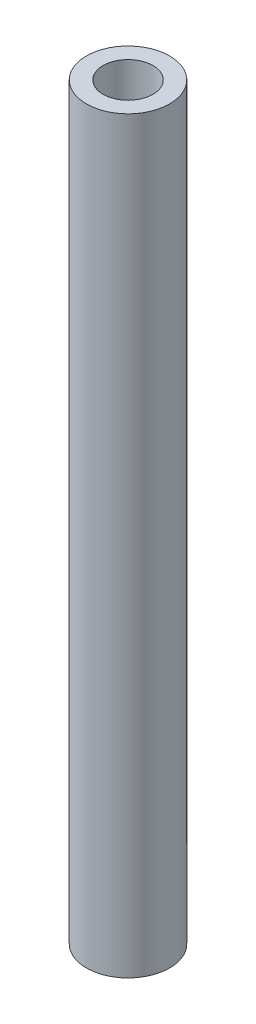
ISO-10303-21;
HEADER;
FILE_DESCRIPTION(('STEP AP214'),'2;1');
FILE_NAME('part.step','',(''),(''),'','','');
FILE_SCHEMA(('AUTOMOTIVE_DESIGN { 1 0 10303 214 1 1 1 1 }'));
ENDSEC;
DATA;
#1=APPLICATION_CONTEXT('core data for automotive mechanical design processes');
#2=APPLICATION_PROTOCOL_DEFINITION('international standard','automotive_design',2000,#1);
#3=PRODUCT_CONTEXT('',#1,'mechanical');
#4=PRODUCT('Part','Part','',(#3));
#5=PRODUCT_RELATED_PRODUCT_CATEGORY('part','',(#4));
#6=PRODUCT_DEFINITION_FORMATION('','',#4);
#7=PRODUCT_DEFINITION_CONTEXT('part definition',#1,'design');
#8=PRODUCT_DEFINITION('design','',#6,#7);
#9=PRODUCT_DEFINITION_SHAPE('','',#8);
#10=(LENGTH_UNIT() NAMED_UNIT(*) SI_UNIT(.MILLI.,.METRE.));
#11=(NAMED_UNIT(*) PLANE_ANGLE_UNIT() SI_UNIT($,.RADIAN.));
#12=(NAMED_UNIT(*) SI_UNIT($,.STERADIAN.) SOLID_ANGLE_UNIT());
#13=UNCERTAINTY_MEASURE_WITH_UNIT(LENGTH_MEASURE(1.E-05),#10,'distance_accuracy_value','');
#14=(GEOMETRIC_REPRESENTATION_CONTEXT(3) GLOBAL_UNCERTAINTY_ASSIGNED_CONTEXT((#13)) GLOBAL_UNIT_ASSIGNED_CONTEXT((#10,
#11,#12)) REPRESENTATION_CONTEXT('',''));
#15=CARTESIAN_POINT('',(0.,0.,0.));
#16=DIRECTION('',(0.,0.,1.));
#17=DIRECTION('',(1.,0.,0.));
#18=AXIS2_PLACEMENT_3D('',#15,#16,#17);
#19=CARTESIAN_POINT('',(0.,45.,0.));
#20=DIRECTION('',(0.,1.,0.));
#21=DIRECTION('',(0.,0.,1.));
#22=AXIS2_PLACEMENT_3D('',#19,#20,#21);
#23=PLANE('',#22);
#24=CARTESIAN_POINT('',(0.,45.,0.));
#25=DIRECTION('',(0.,1.,0.));
#26=DIRECTION('',(0.,0.,1.));
#27=AXIS2_PLACEMENT_3D('',#24,#25,#26);
#28=CIRCLE('',#27,2.5);
#29=CARTESIAN_POINT('',(0.,45.,-2.5));
#30=VERTEX_POINT('',#29);
#31=EDGE_CURVE('E10',#30,#30,#28,.T.);
#32=ORIENTED_EDGE('',*,*,#31,.T.);
#33=EDGE_LOOP('',(#32));
#34=FACE_BOUND('',#33,.T.);
#35=CARTESIAN_POINT('',(0.,45.,0.));
#36=DIRECTION('',(0.,1.,0.));
#37=DIRECTION('',(0.,0.,1.));
#38=AXIS2_PLACEMENT_3D('',#35,#36,#37);
#39=CIRCLE('',#38,1.5);
#40=CARTESIAN_POINT('',(0.,45.,-1.5));
#41=VERTEX_POINT('',#40);
#42=EDGE_CURVE('E45',#41,#41,#39,.T.);
#43=ORIENTED_EDGE('',*,*,#42,.F.);
#44=EDGE_LOOP('',(#43));
#45=FACE_BOUND('',#44,.T.);
#46=ADVANCED_FACE('F34',(#34,#45),#23,.T.);
#47=CARTESIAN_POINT('',(0.,0.,0.));
#48=DIRECTION('',(0.,1.,0.));
#49=DIRECTION('',(0.,0.,1.));
#50=AXIS2_PLACEMENT_3D('',#47,#48,#49);
#51=PLANE('',#50);
#52=CARTESIAN_POINT('',(0.,0.,0.));
#53=DIRECTION('',(0.,1.,0.));
#54=DIRECTION('',(0.,0.,1.));
#55=AXIS2_PLACEMENT_3D('',#52,#53,#54);
#56=CIRCLE('',#55,2.5);
#57=CARTESIAN_POINT('',(0.,0.,-2.5));
#58=VERTEX_POINT('',#57);
#59=EDGE_CURVE('E38',#58,#58,#56,.T.);
#60=ORIENTED_EDGE('',*,*,#59,.F.);
#61=EDGE_LOOP('',(#60));
#62=FACE_BOUND('',#61,.T.);
#63=CARTESIAN_POINT('',(0.,0.,0.));
#64=DIRECTION('',(0.,1.,0.));
#65=DIRECTION('',(0.,0.,1.));
#66=AXIS2_PLACEMENT_3D('',#63,#64,#65);
#67=CIRCLE('',#66,1.5);
#68=CARTESIAN_POINT('',(0.,0.,-1.5));
#69=VERTEX_POINT('',#68);
#70=EDGE_CURVE('E47',#69,#69,#67,.T.);
#71=ORIENTED_EDGE('',*,*,#70,.T.);
#72=EDGE_LOOP('',(#71));
#73=FACE_BOUND('',#72,.T.);
#74=ADVANCED_FACE('F57',(#62,#73),#51,.F.);
#75=CARTESIAN_POINT('',(0.,45.,0.));
#76=DIRECTION('',(0.,-1.,0.));
#77=DIRECTION('',(0.,0.,-1.));
#78=AXIS2_PLACEMENT_3D('',#75,#76,#77);
#79=CYLINDRICAL_SURFACE('',#78,2.5);
#80=CARTESIAN_POINT('',(0.,45.,-2.5));
#81=CARTESIAN_POINT('',(0.,44.53125,-2.5));
#82=CARTESIAN_POINT('',(0.,44.0625,-2.5));
#83=CARTESIAN_POINT('',(0.,43.125,-2.5));
#84=CARTESIAN_POINT('',(0.,42.65625,-2.5));
#85=CARTESIAN_POINT('',(0.,41.71875,-2.5));
#86=CARTESIAN_POINT('',(0.,41.25,-2.5));
#87=CARTESIAN_POINT('',(0.,40.3125,-2.5));
#88=CARTESIAN_POINT('',(0.,39.84375,-2.5));
#89=CARTESIAN_POINT('',(0.,38.90625,-2.5));
#90=CARTESIAN_POINT('',(0.,38.4375,-2.5));
#91=CARTESIAN_POINT('',(0.,37.5,-2.5));
#92=CARTESIAN_POINT('',(0.,37.03125,-2.5));
#93=CARTESIAN_POINT('',(0.,36.09375,-2.5));
#94=CARTESIAN_POINT('',(0.,35.625,-2.5));
#95=CARTESIAN_POINT('',(0.,34.6875,-2.5));
#96=CARTESIAN_POINT('',(0.,34.21875,-2.5));
#97=CARTESIAN_POINT('',(0.,33.28125,-2.5));
#98=CARTESIAN_POINT('',(0.,32.8125,-2.5));
#99=CARTESIAN_POINT('',(0.,31.875,-2.5));
#100=CARTESIAN_POINT('',(0.,31.40625,-2.5));
#101=CARTESIAN_POINT('',(0.,30.46875,-2.5));
#102=CARTESIAN_POINT('',(0.,30.,-2.5));
#103=CARTESIAN_POINT('',(0.,29.0625,-2.5));
#104=CARTESIAN_POINT('',(0.,28.59375,-2.5));
#105=CARTESIAN_POINT('',(0.,27.65625,-2.5));
#106=CARTESIAN_POINT('',(0.,27.1875,-2.5));
#107=CARTESIAN_POINT('',(0.,26.25,-2.5));
#108=CARTESIAN_POINT('',(0.,25.78125,-2.5));
#109=CARTESIAN_POINT('',(0.,24.84375,-2.5));
#110=CARTESIAN_POINT('',(0.,24.375,-2.5));
#111=CARTESIAN_POINT('',(0.,23.4375,-2.5));
#112=CARTESIAN_POINT('',(0.,22.96875,-2.5));
#113=CARTESIAN_POINT('',(0.,22.03125,-2.5));
#114=CARTESIAN_POINT('',(0.,21.5625,-2.5));
#115=CARTESIAN_POINT('',(0.,20.625,-2.5));
#116=CARTESIAN_POINT('',(0.,20.15625,-2.5));
#117=CARTESIAN_POINT('',(0.,19.21875,-2.5));
#118=CARTESIAN_POINT('',(0.,18.75,-2.5));
#119=CARTESIAN_POINT('',(0.,17.8125,-2.5));
#120=CARTESIAN_POINT('',(0.,17.34375,-2.5));
#121=CARTESIAN_POINT('',(0.,16.40625,-2.5));
#122=CARTESIAN_POINT('',(0.,15.9375,-2.5));
#123=CARTESIAN_POINT('',(0.,15.,-2.5));
#124=CARTESIAN_POINT('',(0.,14.53125,-2.5));
#125=CARTESIAN_POINT('',(0.,13.59375,-2.5));
#126=CARTESIAN_POINT('',(0.,13.125,-2.5));
#127=CARTESIAN_POINT('',(0.,12.1875,-2.5));
#128=CARTESIAN_POINT('',(0.,11.71875,-2.5));
#129=CARTESIAN_POINT('',(0.,10.78125,-2.5));
#130=CARTESIAN_POINT('',(0.,10.3125,-2.5));
#131=CARTESIAN_POINT('',(0.,9.37499999999999,-2.5));
#132=CARTESIAN_POINT('',(0.,8.90624999999999,-2.5));
#133=CARTESIAN_POINT('',(0.,7.96874999999999,-2.5));
#134=CARTESIAN_POINT('',(0.,7.5,-2.5));
#135=CARTESIAN_POINT('',(0.,6.56249999999999,-2.5));
#136=CARTESIAN_POINT('',(0.,6.09374999999999,-2.5));
#137=CARTESIAN_POINT('',(0.,5.15624999999999,-2.5));
#138=CARTESIAN_POINT('',(0.,4.68749999999999,-2.5));
#139=CARTESIAN_POINT('',(0.,3.74999999999999,-2.5));
#140=CARTESIAN_POINT('',(0.,3.28124999999999,-2.5));
#141=CARTESIAN_POINT('',(0.,2.34374999999999,-2.5));
#142=CARTESIAN_POINT('',(0.,1.87499999999999,-2.5));
#143=CARTESIAN_POINT('',(0.,0.937499999999992,-2.5));
#144=CARTESIAN_POINT('',(0.,0.468749999999993,-2.5));
#145=CARTESIAN_POINT('',(0.,0.,-2.5));
#146=B_SPLINE_CURVE_WITH_KNOTS('',3,(#80,#81,#82,#83,#84,#85,#86,#87,#88,#89,#90,#91,#92,#93,
#94,#95,#96,#97,#98,#99,#100,#101,#102,#103,#104,#105,#106,#107,#108,#109,#110,#111,#112,#113,
#114,#115,#116,#117,#118,#119,#120,#121,#122,#123,#124,#125,#126,#127,#128,#129,#130,#131,#132,
#133,#134,#135,#136,#137,#138,#139,#140,#141,#142,#143,#144,#145),.UNSPECIFIED.,.F.,.F.,(4,2,2,
2,2,2,2,2,2,2,2,2,2,2,2,2,2,2,2,2,2,2,2,2,2,2,2,2,2,2,2,2,4),(0.,1.40625,2.8125,
4.21874999999999,5.625,7.03125,8.43749999999999,9.84375,11.25,12.65625,14.0625,15.46875,16.875,
18.28125,19.6875,21.09375,22.5,23.90625,25.3125,26.71875,28.125,29.53125,30.9375,32.34375,33.75,
35.15625,36.5625,37.96875,39.375,40.78125,42.1875,43.59375,45.),.UNSPECIFIED.);
#147=EDGE_CURVE('BSEAM36',#30,#58,#146,.T.);
#148=ORIENTED_EDGE('',*,*,#31,.F.);
#149=ORIENTED_EDGE('',*,*,#59,.T.);
#150=ORIENTED_EDGE('',*,*,#147,.T.);
#151=ORIENTED_EDGE('',*,*,#147,.F.);
#152=EDGE_LOOP('',(#148,#150,#149,#151));
#153=FACE_BOUND('',#152,.T.);
#154=ADVANCED_FACE('F36',(#153),#79,.T.);
#155=CARTESIAN_POINT('',(0.,45.,0.));
#156=DIRECTION('',(0.,-1.,0.));
#157=DIRECTION('',(0.,0.,-1.));
#158=AXIS2_PLACEMENT_3D('',#155,#156,#157);
#159=CYLINDRICAL_SURFACE('',#158,1.5);
#160=CARTESIAN_POINT('',(0.,45.,-1.5));
#161=CARTESIAN_POINT('',(0.,44.53125,-1.5));
#162=CARTESIAN_POINT('',(0.,44.0625,-1.5));
#163=CARTESIAN_POINT('',(0.,43.125,-1.5));
#164=CARTESIAN_POINT('',(0.,42.65625,-1.5));
#165=CARTESIAN_POINT('',(0.,41.71875,-1.5));
#166=CARTESIAN_POINT('',(0.,41.25,-1.5));
#167=CARTESIAN_POINT('',(0.,40.3125,-1.5));
#168=CARTESIAN_POINT('',(0.,39.84375,-1.5));
#169=CARTESIAN_POINT('',(0.,38.90625,-1.5));
#170=CARTESIAN_POINT('',(0.,38.4375,-1.5));
#171=CARTESIAN_POINT('',(0.,37.5,-1.5));
#172=CARTESIAN_POINT('',(0.,37.03125,-1.5));
#173=CARTESIAN_POINT('',(0.,36.09375,-1.5));
#174=CARTESIAN_POINT('',(0.,35.625,-1.5));
#175=CARTESIAN_POINT('',(0.,34.6875,-1.5));
#176=CARTESIAN_POINT('',(0.,34.21875,-1.5));
#177=CARTESIAN_POINT('',(0.,33.28125,-1.5));
#178=CARTESIAN_POINT('',(0.,32.8125,-1.5));
#179=CARTESIAN_POINT('',(0.,31.875,-1.5));
#180=CARTESIAN_POINT('',(0.,31.40625,-1.5));
#181=CARTESIAN_POINT('',(0.,30.46875,-1.5));
#182=CARTESIAN_POINT('',(0.,30.,-1.5));
#183=CARTESIAN_POINT('',(0.,29.0625,-1.5));
#184=CARTESIAN_POINT('',(0.,28.59375,-1.5));
#185=CARTESIAN_POINT('',(0.,27.65625,-1.5));
#186=CARTESIAN_POINT('',(0.,27.1875,-1.5));
#187=CARTESIAN_POINT('',(0.,26.25,-1.5));
#188=CARTESIAN_POINT('',(0.,25.78125,-1.5));
#189=CARTESIAN_POINT('',(0.,24.84375,-1.5));
#190=CARTESIAN_POINT('',(0.,24.375,-1.5));
#191=CARTESIAN_POINT('',(0.,23.4375,-1.5));
#192=CARTESIAN_POINT('',(0.,22.96875,-1.5));
#193=CARTESIAN_POINT('',(0.,22.03125,-1.5));
#194=CARTESIAN_POINT('',(0.,21.5625,-1.5));
#195=CARTESIAN_POINT('',(0.,20.625,-1.5));
#196=CARTESIAN_POINT('',(0.,20.15625,-1.5));
#197=CARTESIAN_POINT('',(0.,19.21875,-1.5));
#198=CARTESIAN_POINT('',(0.,18.75,-1.5));
#199=CARTESIAN_POINT('',(0.,17.8125,-1.5));
#200=CARTESIAN_POINT('',(0.,17.34375,-1.5));
#201=CARTESIAN_POINT('',(0.,16.40625,-1.5));
#202=CARTESIAN_POINT('',(0.,15.9375,-1.5));
#203=CARTESIAN_POINT('',(0.,15.,-1.5));
#204=CARTESIAN_POINT('',(0.,14.53125,-1.5));
#205=CARTESIAN_POINT('',(0.,13.59375,-1.5));
#206=CARTESIAN_POINT('',(0.,13.125,-1.5));
#207=CARTESIAN_POINT('',(0.,12.1875,-1.5));
#208=CARTESIAN_POINT('',(0.,11.71875,-1.5));
#209=CARTESIAN_POINT('',(0.,10.78125,-1.5));
#210=CARTESIAN_POINT('',(0.,10.3125,-1.5));
#211=CARTESIAN_POINT('',(0.,9.37499999999999,-1.5));
#212=CARTESIAN_POINT('',(0.,8.90624999999999,-1.5));
#213=CARTESIAN_POINT('',(0.,7.96874999999999,-1.5));
#214=CARTESIAN_POINT('',(0.,7.5,-1.5));
#215=CARTESIAN_POINT('',(0.,6.56249999999999,-1.5));
#216=CARTESIAN_POINT('',(0.,6.09374999999999,-1.5));
#217=CARTESIAN_POINT('',(0.,5.15624999999999,-1.5));
#218=CARTESIAN_POINT('',(0.,4.68749999999999,-1.5));
#219=CARTESIAN_POINT('',(0.,3.74999999999999,-1.5));
#220=CARTESIAN_POINT('',(0.,3.28124999999999,-1.5));
#221=CARTESIAN_POINT('',(0.,2.34374999999999,-1.5));
#222=CARTESIAN_POINT('',(0.,1.87499999999999,-1.5));
#223=CARTESIAN_POINT('',(0.,0.937499999999992,-1.5));
#224=CARTESIAN_POINT('',(0.,0.468749999999993,-1.5));
#225=CARTESIAN_POINT('',(0.,0.,-1.5));
#226=B_SPLINE_CURVE_WITH_KNOTS('',3,(#160,#161,#162,#163,#164,#165,#166,#167,#168,#169,#170,
#171,#172,#173,#174,#175,#176,#177,#178,#179,#180,#181,#182,#183,#184,#185,#186,#187,#188,#189,
#190,#191,#192,#193,#194,#195,#196,#197,#198,#199,#200,#201,#202,#203,#204,#205,#206,#207,#208,
#209,#210,#211,#212,#213,#214,#215,#216,#217,#218,#219,#220,#221,#222,#223,#224,#225),
.UNSPECIFIED.,.F.,.F.,(4,2,2,2,2,2,2,2,2,2,2,2,2,2,2,2,2,2,2,2,2,2,2,2,2,2,2,2,2,2,2,2,4),(0.,
1.40625,2.8125,4.21874999999999,5.625,7.03125,8.43749999999999,9.84375,11.25,12.65625,14.0625,
15.46875,16.875,18.28125,19.6875,21.09375,22.5,23.90625,25.3125,26.71875,28.125,29.53125,
30.9375,32.34375,33.75,35.15625,36.5625,37.96875,39.375,40.78125,42.1875,43.59375,45.),.UNSPECIFIED.);
#227=EDGE_CURVE('BSEAM53',#41,#69,#226,.T.);
#228=ORIENTED_EDGE('',*,*,#42,.T.);
#229=ORIENTED_EDGE('',*,*,#70,.F.);
#230=ORIENTED_EDGE('',*,*,#227,.T.);
#231=ORIENTED_EDGE('',*,*,#227,.F.);
#232=EDGE_LOOP('',(#228,#230,#229,#231));
#233=FACE_BOUND('',#232,.T.);
#234=ADVANCED_FACE('F53',(#233),#159,.F.);
#235=CLOSED_SHELL('',(#46,#74,#154,#234));
#236=MANIFOLD_SOLID_BREP('B2',#235);
#237=ADVANCED_BREP_SHAPE_REPRESENTATION('',(#18,#236),#14);
#238=SHAPE_DEFINITION_REPRESENTATION(#9,#237);
ENDSEC;
END-ISO-10303-21;
